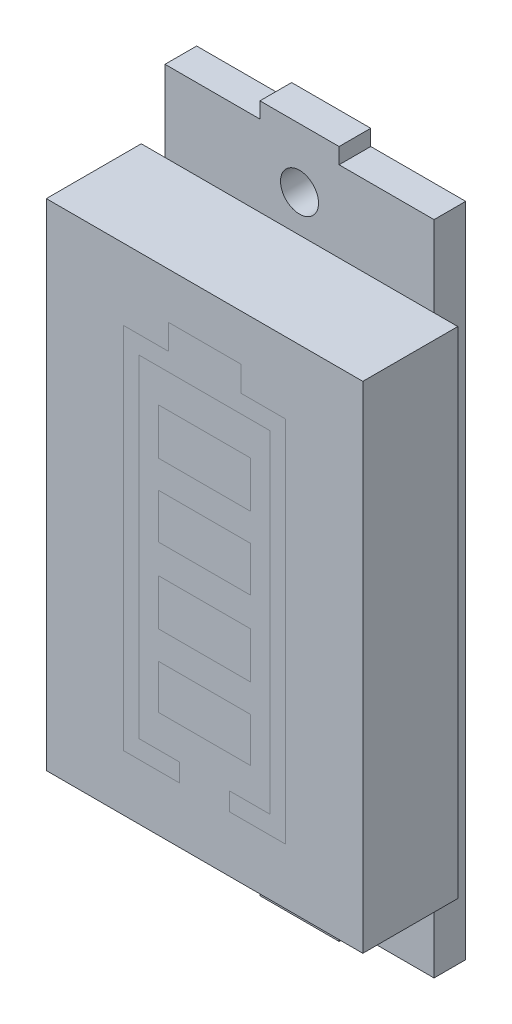
ISO-10303-21;
HEADER;
FILE_DESCRIPTION(('STEP AP214'),'2;1');
FILE_NAME('part.step','',(''),(''),'','','');
FILE_SCHEMA(('AUTOMOTIVE_DESIGN { 1 0 10303 214 1 1 1 1 }'));
ENDSEC;
DATA;
#1=APPLICATION_CONTEXT('core data for automotive mechanical design processes');
#2=APPLICATION_PROTOCOL_DEFINITION('international standard','automotive_design',2000,#1);
#3=PRODUCT_CONTEXT('',#1,'mechanical');
#4=PRODUCT('Part','Part','',(#3));
#5=PRODUCT_RELATED_PRODUCT_CATEGORY('part','',(#4));
#6=PRODUCT_DEFINITION_FORMATION('','',#4);
#7=PRODUCT_DEFINITION_CONTEXT('part definition',#1,'design');
#8=PRODUCT_DEFINITION('design','',#6,#7);
#9=PRODUCT_DEFINITION_SHAPE('','',#8);
#10=(LENGTH_UNIT() NAMED_UNIT(*) SI_UNIT(.MILLI.,.METRE.));
#11=(NAMED_UNIT(*) PLANE_ANGLE_UNIT() SI_UNIT($,.RADIAN.));
#12=(NAMED_UNIT(*) SI_UNIT($,.STERADIAN.) SOLID_ANGLE_UNIT());
#13=UNCERTAINTY_MEASURE_WITH_UNIT(LENGTH_MEASURE(1.E-05),#10,'distance_accuracy_value','');
#14=(GEOMETRIC_REPRESENTATION_CONTEXT(3) GLOBAL_UNCERTAINTY_ASSIGNED_CONTEXT((#13)) GLOBAL_UNIT_ASSIGNED_CONTEXT((#10,
#11,#12)) REPRESENTATION_CONTEXT('',''));
#15=CARTESIAN_POINT('',(0.,0.,0.));
#16=DIRECTION('',(0.,0.,1.));
#17=DIRECTION('',(1.,0.,0.));
#18=AXIS2_PLACEMENT_3D('',#15,#16,#17);
#19=CARTESIAN_POINT('',(0.,0.,6.));
#20=DIRECTION('',(0.,0.,-1.));
#21=DIRECTION('',(-1.,0.,0.));
#22=AXIS2_PLACEMENT_3D('',#19,#20,#21);
#23=PLANE('',#22);
#24=DIRECTION('',(0.,-1.,0.));
#25=VECTOR('',#24,1.);
#26=CARTESIAN_POINT('',(-2.9107326173968,0.,6.));
#27=LINE('',#26,#25);
#28=CARTESIAN_POINT('',(-2.9107326173968,3.2342308849601,6.));
#29=VERTEX_POINT('',#28);
#30=CARTESIAN_POINT('',(-2.9107326173968,0.401295867855901,6.));
#31=VERTEX_POINT('',#30);
#32=EDGE_CURVE('E476',#29,#31,#27,.T.);
#33=ORIENTED_EDGE('',*,*,#32,.F.);
#34=DIRECTION('',(-1.,0.,0.));
#35=VECTOR('',#34,1.);
#36=CARTESIAN_POINT('',(0.,3.2342308849601,6.));
#37=LINE('',#36,#35);
#38=CARTESIAN_POINT('',(2.9107326173968,3.2342308849601,6.));
#39=VERTEX_POINT('',#38);
#40=EDGE_CURVE('E466',#39,#29,#37,.T.);
#41=ORIENTED_EDGE('',*,*,#40,.F.);
#42=DIRECTION('',(0.,1.,0.));
#43=VECTOR('',#42,1.);
#44=CARTESIAN_POINT('',(2.9107326173968,0.,6.));
#45=LINE('',#44,#43);
#46=CARTESIAN_POINT('',(2.9107326173968,0.401295867855901,6.));
#47=VERTEX_POINT('',#46);
#48=EDGE_CURVE('E470',#47,#39,#45,.T.);
#49=ORIENTED_EDGE('',*,*,#48,.F.);
#50=DIRECTION('',(1.,0.,0.));
#51=VECTOR('',#50,1.);
#52=CARTESIAN_POINT('',(0.,0.401295867855901,6.));
#53=LINE('',#52,#51);
#54=EDGE_CURVE('E473',#31,#47,#53,.T.);
#55=ORIENTED_EDGE('',*,*,#54,.F.);
#56=EDGE_LOOP('',(#33,#41,#49,#55));
#57=FACE_BOUND('',#56,.T.);
#58=DIRECTION('',(0.,-1.,0.));
#59=VECTOR('',#58,1.);
#60=CARTESIAN_POINT('',(-2.9107326173968,0.,6.));
#61=LINE('',#60,#59);
#62=CARTESIAN_POINT('',(-2.9107326173968,-6.12532322244118,6.));
#63=VERTEX_POINT('',#62);
#64=CARTESIAN_POINT('',(-2.9107326173968,-8.92129561941144,6.));
#65=VERTEX_POINT('',#64);
#66=EDGE_CURVE('E450',#63,#65,#61,.T.);
#67=ORIENTED_EDGE('',*,*,#66,.F.);
#68=DIRECTION('',(-1.,0.,0.));
#69=VECTOR('',#68,1.);
#70=CARTESIAN_POINT('',(0.,-6.12532322244118,6.));
#71=LINE('',#70,#69);
#72=CARTESIAN_POINT('',(2.9107326173968,-6.12532322244118,6.));
#73=VERTEX_POINT('',#72);
#74=EDGE_CURVE('E440',#73,#63,#71,.T.);
#75=ORIENTED_EDGE('',*,*,#74,.F.);
#76=DIRECTION('',(0.,1.,0.));
#77=VECTOR('',#76,1.);
#78=CARTESIAN_POINT('',(2.9107326173968,0.,6.));
#79=LINE('',#78,#77);
#80=CARTESIAN_POINT('',(2.9107326173968,-8.92129561941144,6.));
#81=VERTEX_POINT('',#80);
#82=EDGE_CURVE('E444',#81,#73,#79,.T.);
#83=ORIENTED_EDGE('',*,*,#82,.F.);
#84=DIRECTION('',(1.,0.,0.));
#85=VECTOR('',#84,1.);
#86=CARTESIAN_POINT('',(0.,-8.92129561941144,6.));
#87=LINE('',#86,#85);
#88=EDGE_CURVE('E447',#65,#81,#87,.T.);
#89=ORIENTED_EDGE('',*,*,#88,.F.);
#90=EDGE_LOOP('',(#67,#75,#83,#89));
#91=FACE_BOUND('',#90,.T.);
#92=DIRECTION('',(0.,1.,0.));
#93=VECTOR('',#92,1.);
#94=CARTESIAN_POINT('',(10.,-15.65,6.));
#95=LINE('',#94,#93);
#96=CARTESIAN_POINT('',(10.,-15.65,6.));
#97=VERTEX_POINT('',#96);
#98=CARTESIAN_POINT('',(10.,15.65,6.));
#99=VERTEX_POINT('',#98);
#100=EDGE_CURVE('E356',#97,#99,#95,.T.);
#101=ORIENTED_EDGE('',*,*,#100,.T.);
#102=DIRECTION('',(-1.,0.,0.));
#103=VECTOR('',#102,1.);
#104=CARTESIAN_POINT('',(-10.,15.65,6.));
#105=LINE('',#104,#103);
#106=CARTESIAN_POINT('',(-10.,15.65,6.));
#107=VERTEX_POINT('',#106);
#108=EDGE_CURVE('E359',#99,#107,#105,.T.);
#109=ORIENTED_EDGE('',*,*,#108,.T.);
#110=DIRECTION('',(0.,-1.,0.));
#111=VECTOR('',#110,1.);
#112=CARTESIAN_POINT('',(-10.,-15.65,6.));
#113=LINE('',#112,#111);
#114=CARTESIAN_POINT('',(-10.,-15.65,6.));
#115=VERTEX_POINT('',#114);
#116=EDGE_CURVE('E362',#107,#115,#113,.T.);
#117=ORIENTED_EDGE('',*,*,#116,.T.);
#118=DIRECTION('',(1.,0.,0.));
#119=VECTOR('',#118,1.);
#120=CARTESIAN_POINT('',(-10.,-15.65,6.));
#121=LINE('',#120,#119);
#122=EDGE_CURVE('E364',#115,#97,#121,.T.);
#123=ORIENTED_EDGE('',*,*,#122,.T.);
#124=EDGE_LOOP('',(#101,#109,#117,#123));
#125=FACE_BOUND('',#124,.T.);
#126=DIRECTION('',(0.,1.,0.));
#127=VECTOR('',#126,1.);
#128=CARTESIAN_POINT('',(-1.58768687317069,0.,6.));
#129=LINE('',#128,#127);
#130=CARTESIAN_POINT('',(-1.58768687317069,-12.1184032650436,6.));
#131=VERTEX_POINT('',#130);
#132=CARTESIAN_POINT('',(-1.58768687317069,-10.972614646314,6.));
#133=VERTEX_POINT('',#132);
#134=EDGE_CURVE('E437',#131,#133,#129,.T.);
#135=ORIENTED_EDGE('',*,*,#134,.F.);
#136=DIRECTION('',(1.,0.,0.));
#137=VECTOR('',#136,1.);
#138=CARTESIAN_POINT('',(0.,-12.1184032650436,6.));
#139=LINE('',#138,#137);
#140=CARTESIAN_POINT('',(-5.11900421161258,-12.1184032650436,6.));
#141=VERTEX_POINT('',#140);
#142=EDGE_CURVE('E391',#141,#131,#139,.T.);
#143=ORIENTED_EDGE('',*,*,#142,.F.);
#144=DIRECTION('',(0.,-1.,0.));
#145=VECTOR('',#144,1.);
#146=CARTESIAN_POINT('',(-5.11900421161258,0.,6.));
#147=LINE('',#146,#145);
#148=CARTESIAN_POINT('',(-5.11900421161258,11.1491322110625,6.));
#149=VERTEX_POINT('',#148);
#150=EDGE_CURVE('E395',#149,#141,#147,.T.);
#151=ORIENTED_EDGE('',*,*,#150,.F.);
#152=DIRECTION('',(-1.,0.,0.));
#153=VECTOR('',#152,1.);
#154=CARTESIAN_POINT('',(0.,11.1491322110625,6.));
#155=LINE('',#154,#153);
#156=CARTESIAN_POINT('',(-2.29362193475144,11.1491322110625,6.));
#157=VERTEX_POINT('',#156);
#158=EDGE_CURVE('E398',#157,#149,#155,.T.);
#159=ORIENTED_EDGE('',*,*,#158,.F.);
#160=DIRECTION('',(0.,-1.,0.));
#161=VECTOR('',#160,1.);
#162=CARTESIAN_POINT('',(-2.29362193475144,0.,6.));
#163=LINE('',#162,#161);
#164=CARTESIAN_POINT('',(-2.29362193475144,12.7390471305929,6.));
#165=VERTEX_POINT('',#164);
#166=EDGE_CURVE('E401',#165,#157,#163,.T.);
#167=ORIENTED_EDGE('',*,*,#166,.F.);
#168=DIRECTION('',(-1.,0.,0.));
#169=VECTOR('',#168,1.);
#170=CARTESIAN_POINT('',(0.,12.7390471305929,6.));
#171=LINE('',#170,#169);
#172=CARTESIAN_POINT('',(2.29362193475143,12.7390471305929,6.));
#173=VERTEX_POINT('',#172);
#174=EDGE_CURVE('E404',#173,#165,#171,.T.);
#175=ORIENTED_EDGE('',*,*,#174,.F.);
#176=DIRECTION('',(0.,1.,0.));
#177=VECTOR('',#176,1.);
#178=CARTESIAN_POINT('',(2.29362193475143,0.,6.));
#179=LINE('',#178,#177);
#180=CARTESIAN_POINT('',(2.29362193475143,11.1491322110625,6.));
#181=VERTEX_POINT('',#180);
#182=EDGE_CURVE('E407',#181,#173,#179,.T.);
#183=ORIENTED_EDGE('',*,*,#182,.F.);
#184=DIRECTION('',(-1.,0.,0.));
#185=VECTOR('',#184,1.);
#186=CARTESIAN_POINT('',(0.,11.1491322110625,6.));
#187=LINE('',#186,#185);
#188=CARTESIAN_POINT('',(5.11900421161257,11.1491322110625,6.));
#189=VERTEX_POINT('',#188);
#190=EDGE_CURVE('E410',#189,#181,#187,.T.);
#191=ORIENTED_EDGE('',*,*,#190,.F.);
#192=DIRECTION('',(0.,1.,0.));
#193=VECTOR('',#192,1.);
#194=CARTESIAN_POINT('',(5.11900421161257,0.,6.));
#195=LINE('',#194,#193);
#196=CARTESIAN_POINT('',(5.11900421161257,-12.1184032650436,6.));
#197=VERTEX_POINT('',#196);
#198=EDGE_CURVE('E413',#197,#189,#195,.T.);
#199=ORIENTED_EDGE('',*,*,#198,.F.);
#200=DIRECTION('',(1.,0.,0.));
#201=VECTOR('',#200,1.);
#202=CARTESIAN_POINT('',(0.,-12.1184032650436,6.));
#203=LINE('',#202,#201);
#204=CARTESIAN_POINT('',(1.58768687317069,-12.1184032650436,6.));
#205=VERTEX_POINT('',#204);
#206=EDGE_CURVE('E416',#205,#197,#203,.T.);
#207=ORIENTED_EDGE('',*,*,#206,.F.);
#208=DIRECTION('',(0.,-1.,0.));
#209=VECTOR('',#208,1.);
#210=CARTESIAN_POINT('',(1.58768687317069,0.,6.));
#211=LINE('',#210,#209);
#212=CARTESIAN_POINT('',(1.58768687317069,-10.972614646314,6.));
#213=VERTEX_POINT('',#212);
#214=EDGE_CURVE('E419',#213,#205,#211,.T.);
#215=ORIENTED_EDGE('',*,*,#214,.F.);
#216=DIRECTION('',(-1.,0.,0.));
#217=VECTOR('',#216,1.);
#218=CARTESIAN_POINT('',(0.,-10.972614646314,6.));
#219=LINE('',#218,#217);
#220=CARTESIAN_POINT('',(4.12847373491433,-10.972614646314,6.));
#221=VERTEX_POINT('',#220);
#222=EDGE_CURVE('E422',#221,#213,#219,.T.);
#223=ORIENTED_EDGE('',*,*,#222,.F.);
#224=DIRECTION('',(0.,-1.,0.));
#225=VECTOR('',#224,1.);
#226=CARTESIAN_POINT('',(4.12847373491433,0.,6.));
#227=LINE('',#226,#225);
#228=CARTESIAN_POINT('',(4.12847373491433,10.0169154362936,6.));
#229=VERTEX_POINT('',#228);
#230=EDGE_CURVE('E425',#229,#221,#227,.T.);
#231=ORIENTED_EDGE('',*,*,#230,.F.);
#232=DIRECTION('',(1.,0.,0.));
#233=VECTOR('',#232,1.);
#234=CARTESIAN_POINT('',(0.,10.0169154362936,6.));
#235=LINE('',#234,#233);
#236=CARTESIAN_POINT('',(-4.12847373491433,10.0169154362936,6.));
#237=VERTEX_POINT('',#236);
#238=EDGE_CURVE('E428',#237,#229,#235,.T.);
#239=ORIENTED_EDGE('',*,*,#238,.F.);
#240=DIRECTION('',(0.,1.,0.));
#241=VECTOR('',#240,1.);
#242=CARTESIAN_POINT('',(-4.12847373491433,0.,6.));
#243=LINE('',#242,#241);
#244=CARTESIAN_POINT('',(-4.12847373491433,-10.972614646314,6.));
#245=VERTEX_POINT('',#244);
#246=EDGE_CURVE('E431',#245,#237,#243,.T.);
#247=ORIENTED_EDGE('',*,*,#246,.F.);
#248=DIRECTION('',(-1.,0.,0.));
#249=VECTOR('',#248,1.);
#250=CARTESIAN_POINT('',(0.,-10.972614646314,6.));
#251=LINE('',#250,#249);
#252=EDGE_CURVE('E434',#133,#245,#251,.T.);
#253=ORIENTED_EDGE('',*,*,#252,.F.);
#254=EDGE_LOOP('',(#135,#143,#151,#159,#167,#175,#183,#191,#199,#207,#215,#223,#231,#239,#247,#253));
#255=FACE_BOUND('',#254,.T.);
#256=DIRECTION('',(0.,-1.,0.));
#257=VECTOR('',#256,1.);
#258=CARTESIAN_POINT('',(-2.9107326173968,0.,6.));
#259=LINE('',#258,#257);
#260=CARTESIAN_POINT('',(-2.9107326173968,-1.44093348775742,6.));
#261=VERTEX_POINT('',#260);
#262=CARTESIAN_POINT('',(-2.9107326173968,-4.35016215370794,6.));
#263=VERTEX_POINT('',#262);
#264=EDGE_CURVE('E463',#261,#263,#259,.T.);
#265=ORIENTED_EDGE('',*,*,#264,.F.);
#266=DIRECTION('',(-1.,0.,0.));
#267=VECTOR('',#266,1.);
#268=CARTESIAN_POINT('',(0.,-1.44093348775742,6.));
#269=LINE('',#268,#267);
#270=CARTESIAN_POINT('',(2.9107326173968,-1.44093348775742,6.));
#271=VERTEX_POINT('',#270);
#272=EDGE_CURVE('E453',#271,#261,#269,.T.);
#273=ORIENTED_EDGE('',*,*,#272,.F.);
#274=DIRECTION('',(0.,1.,0.));
#275=VECTOR('',#274,1.);
#276=CARTESIAN_POINT('',(2.9107326173968,0.,6.));
#277=LINE('',#276,#275);
#278=CARTESIAN_POINT('',(2.9107326173968,-4.35016215370794,6.));
#279=VERTEX_POINT('',#278);
#280=EDGE_CURVE('E457',#279,#271,#277,.T.);
#281=ORIENTED_EDGE('',*,*,#280,.F.);
#282=DIRECTION('',(1.,0.,0.));
#283=VECTOR('',#282,1.);
#284=CARTESIAN_POINT('',(0.,-4.35016215370794,6.));
#285=LINE('',#284,#283);
#286=EDGE_CURVE('E460',#263,#279,#285,.T.);
#287=ORIENTED_EDGE('',*,*,#286,.F.);
#288=EDGE_LOOP('',(#265,#273,#281,#287));
#289=FACE_BOUND('',#288,.T.);
#290=DIRECTION('',(0.,-1.,0.));
#291=VECTOR('',#290,1.);
#292=CARTESIAN_POINT('',(-2.9107326173968,0.,6.));
#293=LINE('',#292,#291);
#294=CARTESIAN_POINT('',(-2.9107326173968,7.90670349185868,6.));
#295=VERTEX_POINT('',#294);
#296=CARTESIAN_POINT('',(-2.9107326173968,4.99048017288609,6.));
#297=VERTEX_POINT('',#296);
#298=EDGE_CURVE('E11',#295,#297,#293,.T.);
#299=ORIENTED_EDGE('',*,*,#298,.F.);
#300=DIRECTION('',(-1.,0.,0.));
#301=VECTOR('',#300,1.);
#302=CARTESIAN_POINT('',(0.,7.90670349185868,6.));
#303=LINE('',#302,#301);
#304=CARTESIAN_POINT('',(2.9107326173968,7.90670349185868,6.));
#305=VERTEX_POINT('',#304);
#306=EDGE_CURVE('E479',#305,#295,#303,.T.);
#307=ORIENTED_EDGE('',*,*,#306,.F.);
#308=DIRECTION('',(0.,1.,0.));
#309=VECTOR('',#308,1.);
#310=CARTESIAN_POINT('',(2.9107326173968,0.,6.));
#311=LINE('',#310,#309);
#312=CARTESIAN_POINT('',(2.9107326173968,4.99048017288609,6.));
#313=VERTEX_POINT('',#312);
#314=EDGE_CURVE('E482',#313,#305,#311,.T.);
#315=ORIENTED_EDGE('',*,*,#314,.F.);
#316=DIRECTION('',(1.,0.,0.));
#317=VECTOR('',#316,1.);
#318=CARTESIAN_POINT('',(0.,4.99048017288609,6.));
#319=LINE('',#318,#317);
#320=EDGE_CURVE('E46',#297,#313,#319,.T.);
#321=ORIENTED_EDGE('',*,*,#320,.F.);
#322=EDGE_LOOP('',(#299,#307,#315,#321));
#323=FACE_BOUND('',#322,.T.);
#324=ADVANCED_FACE('F37',(#57,#91,#125,#255,#289,#323),#23,.F.);
#325=ORIENTED_EDGE('',*,*,#306,.T.);
#326=ORIENTED_EDGE('',*,*,#298,.T.);
#327=ORIENTED_EDGE('',*,*,#320,.T.);
#328=ORIENTED_EDGE('',*,*,#314,.T.);
#329=EDGE_LOOP('',(#325,#326,#327,#328));
#330=FACE_BOUND('',#329,.T.);
#331=ADVANCED_FACE('F550',(#330),#23,.F.);
#332=ORIENTED_EDGE('',*,*,#40,.T.);
#333=ORIENTED_EDGE('',*,*,#32,.T.);
#334=ORIENTED_EDGE('',*,*,#54,.T.);
#335=ORIENTED_EDGE('',*,*,#48,.T.);
#336=EDGE_LOOP('',(#332,#333,#334,#335));
#337=FACE_BOUND('',#336,.T.);
#338=ADVANCED_FACE('F559',(#337),#23,.F.);
#339=ORIENTED_EDGE('',*,*,#272,.T.);
#340=ORIENTED_EDGE('',*,*,#264,.T.);
#341=ORIENTED_EDGE('',*,*,#286,.T.);
#342=ORIENTED_EDGE('',*,*,#280,.T.);
#343=EDGE_LOOP('',(#339,#340,#341,#342));
#344=FACE_BOUND('',#343,.T.);
#345=ADVANCED_FACE('F580',(#344),#23,.F.);
#346=ORIENTED_EDGE('',*,*,#74,.T.);
#347=ORIENTED_EDGE('',*,*,#66,.T.);
#348=ORIENTED_EDGE('',*,*,#88,.T.);
#349=ORIENTED_EDGE('',*,*,#82,.T.);
#350=EDGE_LOOP('',(#346,#347,#348,#349));
#351=FACE_BOUND('',#350,.T.);
#352=ADVANCED_FACE('F567',(#351),#23,.F.);
#353=CARTESIAN_POINT('',(0.,0.,-2.));
#354=DIRECTION('',(0.,0.,1.));
#355=DIRECTION('',(1.,0.,0.));
#356=AXIS2_PLACEMENT_3D('',#353,#354,#355);
#357=PLANE('',#356);
#358=CARTESIAN_POINT('',(0.,-18.,-2.));
#359=DIRECTION('',(0.,0.,-1.));
#360=DIRECTION('',(-1.,0.,0.));
#361=AXIS2_PLACEMENT_3D('',#358,#359,#360);
#362=CIRCLE('',#361,1.2);
#363=CARTESIAN_POINT('',(-1.2,-18.,-2.));
#364=VERTEX_POINT('',#363);
#365=EDGE_CURVE('E705',#364,#364,#362,.T.);
#366=ORIENTED_EDGE('',*,*,#365,.F.);
#367=EDGE_LOOP('',(#366));
#368=FACE_BOUND('',#367,.T.);
#369=DIRECTION('',(-1.,0.,0.));
#370=VECTOR('',#369,1.);
#371=CARTESIAN_POINT('',(8.5,-20.75,-2.));
#372=LINE('',#371,#370);
#373=CARTESIAN_POINT('',(8.5,-20.75,-2.));
#374=VERTEX_POINT('',#373);
#375=CARTESIAN_POINT('',(2.5,-20.75,-2.));
#376=VERTEX_POINT('',#375);
#377=EDGE_CURVE('E325',#374,#376,#372,.T.);
#378=ORIENTED_EDGE('',*,*,#377,.T.);
#379=DIRECTION('',(0.,-1.,0.));
#380=VECTOR('',#379,1.);
#381=CARTESIAN_POINT('',(2.5,-21.75,-2.));
#382=LINE('',#381,#380);
#383=CARTESIAN_POINT('',(2.5,-21.75,-2.));
#384=VERTEX_POINT('',#383);
#385=EDGE_CURVE('E292',#376,#384,#382,.T.);
#386=ORIENTED_EDGE('',*,*,#385,.T.);
#387=DIRECTION('',(-1.,0.,0.));
#388=VECTOR('',#387,1.);
#389=CARTESIAN_POINT('',(2.5,-21.75,-2.));
#390=LINE('',#389,#388);
#391=CARTESIAN_POINT('',(-2.5,-21.75,-2.));
#392=VERTEX_POINT('',#391);
#393=EDGE_CURVE('E266',#384,#392,#390,.T.);
#394=ORIENTED_EDGE('',*,*,#393,.T.);
#395=DIRECTION('',(0.,1.,0.));
#396=VECTOR('',#395,1.);
#397=CARTESIAN_POINT('',(-2.5,-21.75,-2.));
#398=LINE('',#397,#396);
#399=CARTESIAN_POINT('',(-2.5,-20.75,-2.));
#400=VERTEX_POINT('',#399);
#401=EDGE_CURVE('E288',#392,#400,#398,.T.);
#402=ORIENTED_EDGE('',*,*,#401,.T.);
#403=CARTESIAN_POINT('',(-8.5,-20.75,-2.));
#404=VERTEX_POINT('',#403);
#405=EDGE_CURVE('E324',#400,#404,#372,.T.);
#406=ORIENTED_EDGE('',*,*,#405,.T.);
#407=DIRECTION('',(0.,1.,0.));
#408=VECTOR('',#407,1.);
#409=CARTESIAN_POINT('',(-8.5,-20.75,-2.));
#410=LINE('',#409,#408);
#411=CARTESIAN_POINT('',(-8.5,20.75,-2.));
#412=VERTEX_POINT('',#411);
#413=EDGE_CURVE('E314',#404,#412,#410,.T.);
#414=ORIENTED_EDGE('',*,*,#413,.T.);
#415=DIRECTION('',(1.,0.,0.));
#416=VECTOR('',#415,1.);
#417=CARTESIAN_POINT('',(8.5,20.75,-2.));
#418=LINE('',#417,#416);
#419=CARTESIAN_POINT('',(-2.5,20.75,-2.));
#420=VERTEX_POINT('',#419);
#421=EDGE_CURVE('E319',#412,#420,#418,.T.);
#422=ORIENTED_EDGE('',*,*,#421,.T.);
#423=CARTESIAN_POINT('',(-2.5,21.75,-2.));
#424=VERTEX_POINT('',#423);
#425=EDGE_CURVE('E290',#420,#424,#398,.T.);
#426=ORIENTED_EDGE('',*,*,#425,.T.);
#427=DIRECTION('',(1.,0.,0.));
#428=VECTOR('',#427,1.);
#429=CARTESIAN_POINT('',(2.5,21.75,-2.));
#430=LINE('',#429,#428);
#431=CARTESIAN_POINT('',(2.5,21.75,-2.));
#432=VERTEX_POINT('',#431);
#433=EDGE_CURVE('E273',#424,#432,#430,.T.);
#434=ORIENTED_EDGE('',*,*,#433,.T.);
#435=CARTESIAN_POINT('',(2.5,20.75,-2.));
#436=VERTEX_POINT('',#435);
#437=EDGE_CURVE('E293',#432,#436,#382,.T.);
#438=ORIENTED_EDGE('',*,*,#437,.T.);
#439=CARTESIAN_POINT('',(8.5,20.75,-2.));
#440=VERTEX_POINT('',#439);
#441=EDGE_CURVE('E317',#436,#440,#418,.T.);
#442=ORIENTED_EDGE('',*,*,#441,.T.);
#443=DIRECTION('',(0.,-1.,0.));
#444=VECTOR('',#443,1.);
#445=CARTESIAN_POINT('',(8.5,-20.75,-2.));
#446=LINE('',#445,#444);
#447=EDGE_CURVE('E322',#440,#374,#446,.T.);
#448=ORIENTED_EDGE('',*,*,#447,.T.);
#449=EDGE_LOOP('',(#378,#386,#394,#402,#406,#414,#422,#426,#434,#438,#442,#448));
#450=FACE_BOUND('',#449,.T.);
#451=CARTESIAN_POINT('',(0.,18.,-2.));
#452=DIRECTION('',(0.,0.,-1.));
#453=DIRECTION('',(-1.,0.,0.));
#454=AXIS2_PLACEMENT_3D('',#451,#452,#453);
#455=CIRCLE('',#454,1.2);
#456=CARTESIAN_POINT('',(-1.19999999999999,18.,-2.));
#457=VERTEX_POINT('',#456);
#458=EDGE_CURVE('E706',#457,#457,#455,.T.);
#459=ORIENTED_EDGE('',*,*,#458,.F.);
#460=EDGE_LOOP('',(#459));
#461=FACE_BOUND('',#460,.T.);
#462=ADVANCED_FACE('F579',(#368,#450,#461),#357,.F.);
#463=CARTESIAN_POINT('',(8.5,20.75,-2.));
#464=DIRECTION('',(0.,-1.,0.));
#465=DIRECTION('',(0.,0.,-1.));
#466=AXIS2_PLACEMENT_3D('',#463,#464,#465);
#467=PLANE('',#466);
#468=DIRECTION('',(1.,0.,0.));
#469=VECTOR('',#468,1.);
#470=CARTESIAN_POINT('',(8.5,20.75,0.));
#471=LINE('',#470,#469);
#472=CARTESIAN_POINT('',(-8.5,20.75,0.));
#473=VERTEX_POINT('',#472);
#474=CARTESIAN_POINT('',(-2.5,20.75,0.));
#475=VERTEX_POINT('',#474);
#476=EDGE_CURVE('E334',#473,#475,#471,.T.);
#477=ORIENTED_EDGE('',*,*,#476,.T.);
#478=DIRECTION('',(0.,0.,-1.));
#479=VECTOR('',#478,1.);
#480=CARTESIAN_POINT('',(-2.5,20.75,-2.));
#481=LINE('',#480,#479);
#482=EDGE_CURVE('E260',#475,#420,#481,.T.);
#483=ORIENTED_EDGE('',*,*,#482,.T.);
#484=ORIENTED_EDGE('',*,*,#421,.F.);
#485=DIRECTION('',(0.,0.,1.));
#486=VECTOR('',#485,1.);
#487=CARTESIAN_POINT('',(-8.5,20.75,-2.));
#488=LINE('',#487,#486);
#489=EDGE_CURVE('E352',#412,#473,#488,.T.);
#490=ORIENTED_EDGE('',*,*,#489,.T.);
#491=EDGE_LOOP('',(#477,#483,#484,#490));
#492=FACE_BOUND('',#491,.T.);
#493=ADVANCED_FACE('F586',(#492),#467,.F.);
#494=CARTESIAN_POINT('',(8.5,-20.75,-2.));
#495=DIRECTION('',(0.,1.,0.));
#496=DIRECTION('',(0.,0.,1.));
#497=AXIS2_PLACEMENT_3D('',#494,#495,#496);
#498=PLANE('',#497);
#499=ORIENTED_EDGE('',*,*,#405,.F.);
#500=DIRECTION('',(0.,0.,1.));
#501=VECTOR('',#500,1.);
#502=CARTESIAN_POINT('',(-2.5,-20.75,-2.));
#503=LINE('',#502,#501);
#504=CARTESIAN_POINT('',(-2.5,-20.75,0.));
#505=VERTEX_POINT('',#504);
#506=EDGE_CURVE('E309',#400,#505,#503,.T.);
#507=ORIENTED_EDGE('',*,*,#506,.T.);
#508=DIRECTION('',(-1.,0.,0.));
#509=VECTOR('',#508,1.);
#510=CARTESIAN_POINT('',(8.5,-20.75,0.));
#511=LINE('',#510,#509);
#512=CARTESIAN_POINT('',(-8.5,-20.75,0.));
#513=VERTEX_POINT('',#512);
#514=EDGE_CURVE('E340',#505,#513,#511,.T.);
#515=ORIENTED_EDGE('',*,*,#514,.T.);
#516=DIRECTION('',(0.,0.,1.));
#517=VECTOR('',#516,1.);
#518=CARTESIAN_POINT('',(-8.5,-20.75,-2.));
#519=LINE('',#518,#517);
#520=EDGE_CURVE('E328',#404,#513,#519,.T.);
#521=ORIENTED_EDGE('',*,*,#520,.F.);
#522=EDGE_LOOP('',(#499,#507,#515,#521));
#523=FACE_BOUND('',#522,.T.);
#524=ADVANCED_FACE('F672',(#523),#498,.F.);
#525=CARTESIAN_POINT('',(0.,0.,0.));
#526=DIRECTION('',(0.,0.,-1.));
#527=DIRECTION('',(-1.,0.,0.));
#528=AXIS2_PLACEMENT_3D('',#525,#526,#527);
#529=PLANE('',#528);
#530=DIRECTION('',(0.,1.,0.));
#531=VECTOR('',#530,1.);
#532=CARTESIAN_POINT('',(-8.5,-20.75,0.));
#533=LINE('',#532,#531);
#534=CARTESIAN_POINT('',(-8.5,-15.65,0.));
#535=VERTEX_POINT('',#534);
#536=CARTESIAN_POINT('',(-8.5,15.65,0.));
#537=VERTEX_POINT('',#536);
#538=EDGE_CURVE('E333',#535,#537,#533,.T.);
#539=ORIENTED_EDGE('',*,*,#538,.F.);
#540=DIRECTION('',(1.,0.,0.));
#541=VECTOR('',#540,1.);
#542=CARTESIAN_POINT('',(-10.,-15.65,0.));
#543=LINE('',#542,#541);
#544=CARTESIAN_POINT('',(-10.,-15.65,0.));
#545=VERTEX_POINT('',#544);
#546=EDGE_CURVE('E360',#545,#535,#543,.T.);
#547=ORIENTED_EDGE('',*,*,#546,.F.);
#548=DIRECTION('',(0.,-1.,0.));
#549=VECTOR('',#548,1.);
#550=CARTESIAN_POINT('',(-10.,-15.65,0.));
#551=LINE('',#550,#549);
#552=CARTESIAN_POINT('',(-10.,15.65,0.));
#553=VERTEX_POINT('',#552);
#554=EDGE_CURVE('E373',#553,#545,#551,.T.);
#555=ORIENTED_EDGE('',*,*,#554,.F.);
#556=DIRECTION('',(-1.,0.,0.));
#557=VECTOR('',#556,1.);
#558=CARTESIAN_POINT('',(-10.,15.65,0.));
#559=LINE('',#558,#557);
#560=EDGE_CURVE('E369',#537,#553,#559,.T.);
#561=ORIENTED_EDGE('',*,*,#560,.F.);
#562=EDGE_LOOP('',(#539,#547,#555,#561));
#563=FACE_BOUND('',#562,.T.);
#564=ADVANCED_FACE('F574',(#563),#529,.T.);
#565=CARTESIAN_POINT('',(10.,-15.65,6.));
#566=DIRECTION('',(-1.,0.,0.));
#567=DIRECTION('',(0.,0.,1.));
#568=AXIS2_PLACEMENT_3D('',#565,#566,#567);
#569=PLANE('',#568);
#570=DIRECTION('',(0.,1.,0.));
#571=VECTOR('',#570,1.);
#572=CARTESIAN_POINT('',(10.,-15.65,0.));
#573=LINE('',#572,#571);
#574=CARTESIAN_POINT('',(10.,-15.65,0.));
#575=VERTEX_POINT('',#574);
#576=CARTESIAN_POINT('',(10.,15.65,0.));
#577=VERTEX_POINT('',#576);
#578=EDGE_CURVE('E355',#575,#577,#573,.T.);
#579=ORIENTED_EDGE('',*,*,#578,.T.);
#580=DIRECTION('',(0.,0.,-1.));
#581=VECTOR('',#580,1.);
#582=CARTESIAN_POINT('',(10.,15.65,6.));
#583=LINE('',#582,#581);
#584=EDGE_CURVE('E388',#99,#577,#583,.T.);
#585=ORIENTED_EDGE('',*,*,#584,.F.);
#586=ORIENTED_EDGE('',*,*,#100,.F.);
#587=DIRECTION('',(0.,0.,-1.));
#588=VECTOR('',#587,1.);
#589=CARTESIAN_POINT('',(10.,-15.65,6.));
#590=LINE('',#589,#588);
#591=EDGE_CURVE('E366',#97,#575,#590,.T.);
#592=ORIENTED_EDGE('',*,*,#591,.T.);
#593=EDGE_LOOP('',(#579,#585,#586,#592));
#594=FACE_BOUND('',#593,.T.);
#595=ADVANCED_FACE('F39',(#594),#569,.F.);
#596=CARTESIAN_POINT('',(-10.,15.65,6.));
#597=DIRECTION('',(0.,-1.,0.));
#598=DIRECTION('',(0.,0.,-1.));
#599=AXIS2_PLACEMENT_3D('',#596,#597,#598);
#600=PLANE('',#599);
#601=CARTESIAN_POINT('',(8.5,15.65,0.));
#602=VERTEX_POINT('',#601);
#603=EDGE_CURVE('E370',#577,#602,#559,.T.);
#604=ORIENTED_EDGE('',*,*,#603,.T.);
#605=EDGE_CURVE('E374',#602,#537,#559,.T.);
#606=ORIENTED_EDGE('',*,*,#605,.T.);
#607=ORIENTED_EDGE('',*,*,#560,.T.);
#608=DIRECTION('',(0.,0.,-1.));
#609=VECTOR('',#608,1.);
#610=CARTESIAN_POINT('',(-10.,15.65,6.));
#611=LINE('',#610,#609);
#612=EDGE_CURVE('E385',#107,#553,#611,.T.);
#613=ORIENTED_EDGE('',*,*,#612,.F.);
#614=ORIENTED_EDGE('',*,*,#108,.F.);
#615=ORIENTED_EDGE('',*,*,#584,.T.);
#616=EDGE_LOOP('',(#604,#606,#607,#613,#614,#615));
#617=FACE_BOUND('',#616,.T.);
#618=ADVANCED_FACE('F622',(#617),#600,.F.);
#619=CARTESIAN_POINT('',(-10.,-15.65,6.));
#620=DIRECTION('',(1.,0.,0.));
#621=DIRECTION('',(0.,0.,-1.));
#622=AXIS2_PLACEMENT_3D('',#619,#620,#621);
#623=PLANE('',#622);
#624=ORIENTED_EDGE('',*,*,#554,.T.);
#625=DIRECTION('',(0.,0.,-1.));
#626=VECTOR('',#625,1.);
#627=CARTESIAN_POINT('',(-10.,-15.65,6.));
#628=LINE('',#627,#626);
#629=EDGE_CURVE('E382',#115,#545,#628,.T.);
#630=ORIENTED_EDGE('',*,*,#629,.F.);
#631=ORIENTED_EDGE('',*,*,#116,.F.);
#632=ORIENTED_EDGE('',*,*,#612,.T.);
#633=EDGE_LOOP('',(#624,#630,#631,#632));
#634=FACE_BOUND('',#633,.T.);
#635=ADVANCED_FACE('F575',(#634),#623,.F.);
#636=CARTESIAN_POINT('',(-10.,-15.65,6.));
#637=DIRECTION('',(0.,1.,0.));
#638=DIRECTION('',(0.,0.,1.));
#639=AXIS2_PLACEMENT_3D('',#636,#637,#638);
#640=PLANE('',#639);
#641=ORIENTED_EDGE('',*,*,#546,.T.);
#642=CARTESIAN_POINT('',(8.5,-15.65,0.));
#643=VERTEX_POINT('',#642);
#644=EDGE_CURVE('E379',#535,#643,#543,.T.);
#645=ORIENTED_EDGE('',*,*,#644,.T.);
#646=EDGE_CURVE('E376',#643,#575,#543,.T.);
#647=ORIENTED_EDGE('',*,*,#646,.T.);
#648=ORIENTED_EDGE('',*,*,#591,.F.);
#649=ORIENTED_EDGE('',*,*,#122,.F.);
#650=ORIENTED_EDGE('',*,*,#629,.T.);
#651=EDGE_LOOP('',(#641,#645,#647,#648,#649,#650));
#652=FACE_BOUND('',#651,.T.);
#653=ADVANCED_FACE('F565',(#652),#640,.F.);
#654=ORIENTED_EDGE('',*,*,#142,.T.);
#655=ORIENTED_EDGE('',*,*,#134,.T.);
#656=ORIENTED_EDGE('',*,*,#252,.T.);
#657=ORIENTED_EDGE('',*,*,#246,.T.);
#658=ORIENTED_EDGE('',*,*,#238,.T.);
#659=ORIENTED_EDGE('',*,*,#230,.T.);
#660=ORIENTED_EDGE('',*,*,#222,.T.);
#661=ORIENTED_EDGE('',*,*,#214,.T.);
#662=ORIENTED_EDGE('',*,*,#206,.T.);
#663=ORIENTED_EDGE('',*,*,#198,.T.);
#664=ORIENTED_EDGE('',*,*,#190,.T.);
#665=ORIENTED_EDGE('',*,*,#182,.T.);
#666=ORIENTED_EDGE('',*,*,#174,.T.);
#667=ORIENTED_EDGE('',*,*,#166,.T.);
#668=ORIENTED_EDGE('',*,*,#158,.T.);
#669=ORIENTED_EDGE('',*,*,#150,.T.);
#670=EDGE_LOOP('',(#654,#655,#656,#657,#658,#659,#660,#661,#662,#663,#664,#665,#666,#667,#668,#669));
#671=FACE_BOUND('',#670,.T.);
#672=ADVANCED_FACE('F555',(#671),#23,.F.);
#673=DIRECTION('',(0.,-1.,0.));
#674=VECTOR('',#673,1.);
#675=CARTESIAN_POINT('',(8.5,-20.75,0.));
#676=LINE('',#675,#674);
#677=EDGE_CURVE('E341',#602,#643,#676,.T.);
#678=ORIENTED_EDGE('',*,*,#677,.F.);
#679=ORIENTED_EDGE('',*,*,#603,.F.);
#680=ORIENTED_EDGE('',*,*,#578,.F.);
#681=ORIENTED_EDGE('',*,*,#646,.F.);
#682=EDGE_LOOP('',(#678,#679,#680,#681));
#683=FACE_BOUND('',#682,.T.);
#684=ADVANCED_FACE('F564',(#683),#529,.T.);
#685=CARTESIAN_POINT('',(0.,0.,0.));
#686=DIRECTION('',(0.,0.,1.));
#687=DIRECTION('',(1.,0.,0.));
#688=AXIS2_PLACEMENT_3D('',#685,#686,#687);
#689=PLANE('',#688);
#690=CARTESIAN_POINT('',(0.,-18.,0.));
#691=DIRECTION('',(0.,0.,1.));
#692=DIRECTION('',(1.,0.,0.));
#693=AXIS2_PLACEMENT_3D('',#690,#691,#692);
#694=CIRCLE('',#693,1.2);
#695=CARTESIAN_POINT('',(1.2,-18.,0.));
#696=VERTEX_POINT('',#695);
#697=EDGE_CURVE('E709',#696,#696,#694,.T.);
#698=ORIENTED_EDGE('',*,*,#697,.F.);
#699=EDGE_LOOP('',(#698));
#700=FACE_BOUND('',#699,.T.);
#701=CARTESIAN_POINT('',(8.5,-20.75,0.));
#702=VERTEX_POINT('',#701);
#703=EDGE_CURVE('E336',#643,#702,#676,.T.);
#704=ORIENTED_EDGE('',*,*,#703,.F.);
#705=ORIENTED_EDGE('',*,*,#644,.F.);
#706=EDGE_CURVE('E329',#513,#535,#533,.T.);
#707=ORIENTED_EDGE('',*,*,#706,.F.);
#708=ORIENTED_EDGE('',*,*,#514,.F.);
#709=DIRECTION('',(0.,1.,0.));
#710=VECTOR('',#709,1.);
#711=CARTESIAN_POINT('',(-2.5,-21.75,0.));
#712=LINE('',#711,#710);
#713=CARTESIAN_POINT('',(-2.5,-21.75,0.));
#714=VERTEX_POINT('',#713);
#715=EDGE_CURVE('E265',#714,#505,#712,.T.);
#716=ORIENTED_EDGE('',*,*,#715,.F.);
#717=DIRECTION('',(-1.,0.,0.));
#718=VECTOR('',#717,1.);
#719=CARTESIAN_POINT('',(2.5,-21.75,0.));
#720=LINE('',#719,#718);
#721=CARTESIAN_POINT('',(2.5,-21.75,0.));
#722=VERTEX_POINT('',#721);
#723=EDGE_CURVE('E275',#722,#714,#720,.T.);
#724=ORIENTED_EDGE('',*,*,#723,.F.);
#725=DIRECTION('',(0.,-1.,0.));
#726=VECTOR('',#725,1.);
#727=CARTESIAN_POINT('',(2.5,-21.75,0.));
#728=LINE('',#727,#726);
#729=CARTESIAN_POINT('',(2.5,-20.75,0.));
#730=VERTEX_POINT('',#729);
#731=EDGE_CURVE('E281',#730,#722,#728,.T.);
#732=ORIENTED_EDGE('',*,*,#731,.F.);
#733=EDGE_CURVE('E318',#702,#730,#511,.T.);
#734=ORIENTED_EDGE('',*,*,#733,.F.);
#735=EDGE_LOOP('',(#704,#705,#707,#708,#716,#724,#732,#734));
#736=FACE_BOUND('',#735,.T.);
#737=ADVANCED_FACE('F572',(#700,#736),#689,.T.);
#738=CARTESIAN_POINT('',(0.,18.,0.));
#739=DIRECTION('',(0.,0.,1.));
#740=DIRECTION('',(1.,0.,0.));
#741=AXIS2_PLACEMENT_3D('',#738,#739,#740);
#742=CIRCLE('',#741,1.2);
#743=CARTESIAN_POINT('',(1.20000000000001,18.,0.));
#744=VERTEX_POINT('',#743);
#745=EDGE_CURVE('E703',#744,#744,#742,.T.);
#746=ORIENTED_EDGE('',*,*,#745,.F.);
#747=EDGE_LOOP('',(#746));
#748=FACE_BOUND('',#747,.T.);
#749=CARTESIAN_POINT('',(2.5,20.75,0.));
#750=VERTEX_POINT('',#749);
#751=CARTESIAN_POINT('',(8.5,20.75,0.));
#752=VERTEX_POINT('',#751);
#753=EDGE_CURVE('E332',#750,#752,#471,.T.);
#754=ORIENTED_EDGE('',*,*,#753,.F.);
#755=CARTESIAN_POINT('',(2.5,21.75,0.));
#756=VERTEX_POINT('',#755);
#757=EDGE_CURVE('E280',#756,#750,#728,.T.);
#758=ORIENTED_EDGE('',*,*,#757,.F.);
#759=DIRECTION('',(1.,0.,0.));
#760=VECTOR('',#759,1.);
#761=CARTESIAN_POINT('',(2.5,21.75,0.));
#762=LINE('',#761,#760);
#763=CARTESIAN_POINT('',(-2.5,21.75,0.));
#764=VERTEX_POINT('',#763);
#765=EDGE_CURVE('E271',#764,#756,#762,.T.);
#766=ORIENTED_EDGE('',*,*,#765,.F.);
#767=EDGE_CURVE('E254',#475,#764,#712,.T.);
#768=ORIENTED_EDGE('',*,*,#767,.F.);
#769=ORIENTED_EDGE('',*,*,#476,.F.);
#770=EDGE_CURVE('E313',#537,#473,#533,.T.);
#771=ORIENTED_EDGE('',*,*,#770,.F.);
#772=ORIENTED_EDGE('',*,*,#605,.F.);
#773=EDGE_CURVE('E337',#752,#602,#676,.T.);
#774=ORIENTED_EDGE('',*,*,#773,.F.);
#775=EDGE_LOOP('',(#754,#758,#766,#768,#769,#771,#772,#774));
#776=FACE_BOUND('',#775,.T.);
#777=ADVANCED_FACE('F279',(#748,#776),#689,.T.);
#778=CARTESIAN_POINT('',(-8.5,-20.75,-2.));
#779=DIRECTION('',(1.,0.,0.));
#780=DIRECTION('',(0.,0.,-1.));
#781=AXIS2_PLACEMENT_3D('',#778,#779,#780);
#782=PLANE('',#781);
#783=ORIENTED_EDGE('',*,*,#706,.T.);
#784=ORIENTED_EDGE('',*,*,#538,.T.);
#785=ORIENTED_EDGE('',*,*,#770,.T.);
#786=ORIENTED_EDGE('',*,*,#489,.F.);
#787=ORIENTED_EDGE('',*,*,#413,.F.);
#788=ORIENTED_EDGE('',*,*,#520,.T.);
#789=EDGE_LOOP('',(#783,#784,#785,#786,#787,#788));
#790=FACE_BOUND('',#789,.T.);
#791=ADVANCED_FACE('F666',(#790),#782,.F.);
#792=ORIENTED_EDGE('',*,*,#441,.F.);
#793=DIRECTION('',(0.,0.,1.));
#794=VECTOR('',#793,1.);
#795=CARTESIAN_POINT('',(2.5,20.75,-2.));
#796=LINE('',#795,#794);
#797=EDGE_CURVE('E306',#436,#750,#796,.T.);
#798=ORIENTED_EDGE('',*,*,#797,.T.);
#799=ORIENTED_EDGE('',*,*,#753,.T.);
#800=DIRECTION('',(0.,0.,1.));
#801=VECTOR('',#800,1.);
#802=CARTESIAN_POINT('',(8.5,20.75,-2.));
#803=LINE('',#802,#801);
#804=EDGE_CURVE('E349',#440,#752,#803,.T.);
#805=ORIENTED_EDGE('',*,*,#804,.F.);
#806=EDGE_LOOP('',(#792,#798,#799,#805));
#807=FACE_BOUND('',#806,.T.);
#808=ADVANCED_FACE('F692',(#807),#467,.F.);
#809=CARTESIAN_POINT('',(8.5,-20.75,-2.));
#810=DIRECTION('',(-1.,0.,0.));
#811=DIRECTION('',(0.,0.,1.));
#812=AXIS2_PLACEMENT_3D('',#809,#810,#811);
#813=PLANE('',#812);
#814=ORIENTED_EDGE('',*,*,#773,.T.);
#815=ORIENTED_EDGE('',*,*,#677,.T.);
#816=ORIENTED_EDGE('',*,*,#703,.T.);
#817=DIRECTION('',(0.,0.,1.));
#818=VECTOR('',#817,1.);
#819=CARTESIAN_POINT('',(8.5,-20.75,-2.));
#820=LINE('',#819,#818);
#821=EDGE_CURVE('E346',#374,#702,#820,.T.);
#822=ORIENTED_EDGE('',*,*,#821,.F.);
#823=ORIENTED_EDGE('',*,*,#447,.F.);
#824=ORIENTED_EDGE('',*,*,#804,.T.);
#825=EDGE_LOOP('',(#814,#815,#816,#822,#823,#824));
#826=FACE_BOUND('',#825,.T.);
#827=ADVANCED_FACE('F636',(#826),#813,.F.);
#828=ORIENTED_EDGE('',*,*,#733,.T.);
#829=DIRECTION('',(0.,0.,-1.));
#830=VECTOR('',#829,1.);
#831=CARTESIAN_POINT('',(2.5,-20.75,-2.));
#832=LINE('',#831,#830);
#833=EDGE_CURVE('E299',#730,#376,#832,.T.);
#834=ORIENTED_EDGE('',*,*,#833,.T.);
#835=ORIENTED_EDGE('',*,*,#377,.F.);
#836=ORIENTED_EDGE('',*,*,#821,.T.);
#837=EDGE_LOOP('',(#828,#834,#835,#836));
#838=FACE_BOUND('',#837,.T.);
#839=ADVANCED_FACE('F643',(#838),#498,.F.);
#840=CARTESIAN_POINT('',(2.5,-21.75,0.));
#841=DIRECTION('',(0.,-1.,0.));
#842=DIRECTION('',(0.,0.,-1.));
#843=AXIS2_PLACEMENT_3D('',#840,#841,#842);
#844=PLANE('',#843);
#845=ORIENTED_EDGE('',*,*,#393,.F.);
#846=DIRECTION('',(0.,0.,-1.));
#847=VECTOR('',#846,1.);
#848=CARTESIAN_POINT('',(2.5,-21.75,0.));
#849=LINE('',#848,#847);
#850=EDGE_CURVE('E300',#722,#384,#849,.T.);
#851=ORIENTED_EDGE('',*,*,#850,.F.);
#852=ORIENTED_EDGE('',*,*,#723,.T.);
#853=DIRECTION('',(0.,0.,-1.));
#854=VECTOR('',#853,1.);
#855=CARTESIAN_POINT('',(-2.5,-21.75,0.));
#856=LINE('',#855,#854);
#857=EDGE_CURVE('E297',#714,#392,#856,.T.);
#858=ORIENTED_EDGE('',*,*,#857,.T.);
#859=EDGE_LOOP('',(#845,#851,#852,#858));
#860=FACE_BOUND('',#859,.T.);
#861=ADVANCED_FACE('F652',(#860),#844,.T.);
#862=CARTESIAN_POINT('',(2.5,-21.75,0.));
#863=DIRECTION('',(1.,0.,0.));
#864=DIRECTION('',(0.,0.,-1.));
#865=AXIS2_PLACEMENT_3D('',#862,#863,#864);
#866=PLANE('',#865);
#867=ORIENTED_EDGE('',*,*,#833,.F.);
#868=ORIENTED_EDGE('',*,*,#731,.T.);
#869=ORIENTED_EDGE('',*,*,#850,.T.);
#870=ORIENTED_EDGE('',*,*,#385,.F.);
#871=EDGE_LOOP('',(#867,#868,#869,#870));
#872=FACE_BOUND('',#871,.T.);
#873=ADVANCED_FACE('F649',(#872),#866,.T.);
#874=CARTESIAN_POINT('',(-2.5,-21.75,0.));
#875=DIRECTION('',(-1.,0.,0.));
#876=DIRECTION('',(0.,0.,1.));
#877=AXIS2_PLACEMENT_3D('',#874,#875,#876);
#878=PLANE('',#877);
#879=ORIENTED_EDGE('',*,*,#506,.F.);
#880=ORIENTED_EDGE('',*,*,#401,.F.);
#881=ORIENTED_EDGE('',*,*,#857,.F.);
#882=ORIENTED_EDGE('',*,*,#715,.T.);
#883=EDGE_LOOP('',(#879,#880,#881,#882));
#884=FACE_BOUND('',#883,.T.);
#885=ADVANCED_FACE('F674',(#884),#878,.T.);
#886=ORIENTED_EDGE('',*,*,#482,.F.);
#887=ORIENTED_EDGE('',*,*,#767,.T.);
#888=DIRECTION('',(0.,0.,-1.));
#889=VECTOR('',#888,1.);
#890=CARTESIAN_POINT('',(-2.5,21.75,0.));
#891=LINE('',#890,#889);
#892=EDGE_CURVE('E257',#764,#424,#891,.T.);
#893=ORIENTED_EDGE('',*,*,#892,.T.);
#894=ORIENTED_EDGE('',*,*,#425,.F.);
#895=EDGE_LOOP('',(#886,#887,#893,#894));
#896=FACE_BOUND('',#895,.T.);
#897=ADVANCED_FACE('F256',(#896),#878,.T.);
#898=ORIENTED_EDGE('',*,*,#797,.F.);
#899=ORIENTED_EDGE('',*,*,#437,.F.);
#900=DIRECTION('',(0.,0.,-1.));
#901=VECTOR('',#900,1.);
#902=CARTESIAN_POINT('',(2.5,21.75,0.));
#903=LINE('',#902,#901);
#904=EDGE_CURVE('E274',#756,#432,#903,.T.);
#905=ORIENTED_EDGE('',*,*,#904,.F.);
#906=ORIENTED_EDGE('',*,*,#757,.T.);
#907=EDGE_LOOP('',(#898,#899,#905,#906));
#908=FACE_BOUND('',#907,.T.);
#909=ADVANCED_FACE('F681',(#908),#866,.T.);
#910=CARTESIAN_POINT('',(2.5,21.75,0.));
#911=DIRECTION('',(0.,1.,0.));
#912=DIRECTION('',(0.,0.,1.));
#913=AXIS2_PLACEMENT_3D('',#910,#911,#912);
#914=PLANE('',#913);
#915=ORIENTED_EDGE('',*,*,#433,.F.);
#916=ORIENTED_EDGE('',*,*,#892,.F.);
#917=ORIENTED_EDGE('',*,*,#765,.T.);
#918=ORIENTED_EDGE('',*,*,#904,.T.);
#919=EDGE_LOOP('',(#915,#916,#917,#918));
#920=FACE_BOUND('',#919,.T.);
#921=ADVANCED_FACE('F270',(#920),#914,.T.);
#922=CARTESIAN_POINT('',(0.,-18.,-2.));
#923=DIRECTION('',(0.,0.,-1.));
#924=DIRECTION('',(-1.,0.,0.));
#925=AXIS2_PLACEMENT_3D('',#922,#923,#924);
#926=CYLINDRICAL_SURFACE('',#925,1.2);
#927=ORIENTED_EDGE('',*,*,#365,.T.);
#928=EDGE_LOOP('',(#927));
#929=FACE_BOUND('',#928,.T.);
#930=ORIENTED_EDGE('',*,*,#697,.T.);
#931=EDGE_LOOP('',(#930));
#932=FACE_BOUND('',#931,.T.);
#933=ADVANCED_FACE('F800',(#929,#932),#926,.F.);
#934=CARTESIAN_POINT('',(0.,18.,-2.));
#935=DIRECTION('',(0.,0.,-1.));
#936=DIRECTION('',(-1.,0.,0.));
#937=AXIS2_PLACEMENT_3D('',#934,#935,#936);
#938=CYLINDRICAL_SURFACE('',#937,1.2);
#939=ORIENTED_EDGE('',*,*,#458,.T.);
#940=EDGE_LOOP('',(#939));
#941=FACE_BOUND('',#940,.T.);
#942=ORIENTED_EDGE('',*,*,#745,.T.);
#943=EDGE_LOOP('',(#942));
#944=FACE_BOUND('',#943,.T.);
#945=ADVANCED_FACE('F827',(#941,#944),#938,.F.);
#946=CLOSED_SHELL('',(#324,#331,#338,#345,#352,#462,#493,#524,#564,#595,#618,#635,#653,#672,
#684,#737,#777,#791,#808,#827,#839,#861,#873,#885,#897,#909,#921,#933,#945));
#947=MANIFOLD_SOLID_BREP('B2',#946);
#948=ADVANCED_BREP_SHAPE_REPRESENTATION('',(#18,#947),#14);
#949=SHAPE_DEFINITION_REPRESENTATION(#9,#948);
ENDSEC;
END-ISO-10303-21;
